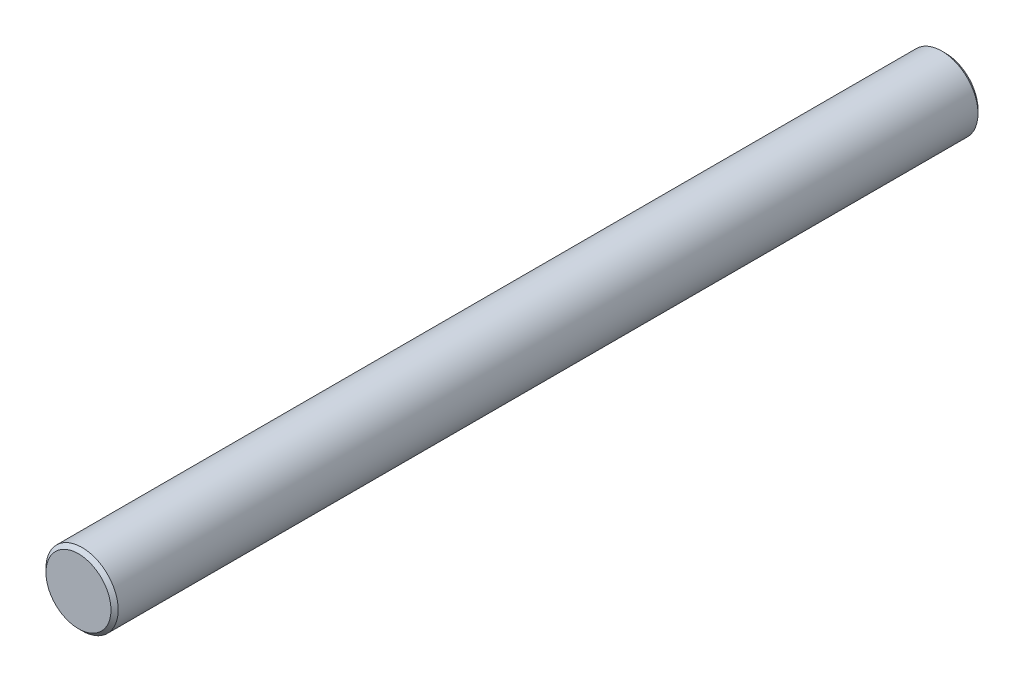
ISO-10303-21;
HEADER;
FILE_DESCRIPTION(('STEP AP214'),'2;1');
FILE_NAME('part.step','',(''),(''),'','','');
FILE_SCHEMA(('AUTOMOTIVE_DESIGN { 1 0 10303 214 1 1 1 1 }'));
ENDSEC;
DATA;
#1=APPLICATION_CONTEXT('core data for automotive mechanical design processes');
#2=APPLICATION_PROTOCOL_DEFINITION('international standard','automotive_design',2000,#1);
#3=PRODUCT_CONTEXT('',#1,'mechanical');
#4=PRODUCT('Part','Part','',(#3));
#5=PRODUCT_RELATED_PRODUCT_CATEGORY('part','',(#4));
#6=PRODUCT_DEFINITION_FORMATION('','',#4);
#7=PRODUCT_DEFINITION_CONTEXT('part definition',#1,'design');
#8=PRODUCT_DEFINITION('design','',#6,#7);
#9=PRODUCT_DEFINITION_SHAPE('','',#8);
#10=(LENGTH_UNIT() NAMED_UNIT(*) SI_UNIT(.MILLI.,.METRE.));
#11=(NAMED_UNIT(*) PLANE_ANGLE_UNIT() SI_UNIT($,.RADIAN.));
#12=(NAMED_UNIT(*) SI_UNIT($,.STERADIAN.) SOLID_ANGLE_UNIT());
#13=UNCERTAINTY_MEASURE_WITH_UNIT(LENGTH_MEASURE(1.E-05),#10,'distance_accuracy_value','');
#14=(GEOMETRIC_REPRESENTATION_CONTEXT(3) GLOBAL_UNCERTAINTY_ASSIGNED_CONTEXT((#13)) GLOBAL_UNIT_ASSIGNED_CONTEXT((#10,
#11,#12)) REPRESENTATION_CONTEXT('',''));
#15=CARTESIAN_POINT('',(0.,0.,0.));
#16=DIRECTION('',(0.,0.,1.));
#17=DIRECTION('',(1.,0.,0.));
#18=AXIS2_PLACEMENT_3D('',#15,#16,#17);
#19=CARTESIAN_POINT('',(0.,0.,60.));
#20=DIRECTION('',(0.,0.,-1.));
#21=DIRECTION('',(-1.,0.,0.));
#22=AXIS2_PLACEMENT_3D('',#19,#20,#21);
#23=CYLINDRICAL_SURFACE('',#22,5.);
#24=CARTESIAN_POINT('',(0.,0.,-59.5));
#25=DIRECTION('',(0.,0.,1.));
#26=DIRECTION('',(1.,0.,0.));
#27=AXIS2_PLACEMENT_3D('',#24,#25,#26);
#28=CIRCLE('',#27,5.);
#29=CARTESIAN_POINT('',(5.,0.,-59.5));
#30=VERTEX_POINT('',#29);
#31=EDGE_CURVE('E51',#30,#30,#28,.T.);
#32=ORIENTED_EDGE('',*,*,#31,.T.);
#33=EDGE_LOOP('',(#32));
#34=FACE_BOUND('',#33,.T.);
#35=CARTESIAN_POINT('',(0.,0.,59.5));
#36=DIRECTION('',(0.,0.,1.));
#37=DIRECTION('',(1.,0.,0.));
#38=AXIS2_PLACEMENT_3D('',#35,#36,#37);
#39=CIRCLE('',#38,5.);
#40=CARTESIAN_POINT('',(5.,0.,59.5));
#41=VERTEX_POINT('',#40);
#42=EDGE_CURVE('E55',#41,#41,#39,.F.);
#43=ORIENTED_EDGE('',*,*,#42,.T.);
#44=EDGE_LOOP('',(#43));
#45=FACE_BOUND('',#44,.T.);
#46=ADVANCED_FACE('F39',(#34,#45),#23,.T.);
#47=CARTESIAN_POINT('',(0.,0.,60.));
#48=DIRECTION('',(0.,0.,1.));
#49=DIRECTION('',(1.,0.,0.));
#50=AXIS2_PLACEMENT_3D('',#47,#48,#49);
#51=PLANE('',#50);
#52=CARTESIAN_POINT('',(0.,0.,60.));
#53=DIRECTION('',(0.,0.,1.));
#54=DIRECTION('',(1.,0.,0.));
#55=AXIS2_PLACEMENT_3D('',#52,#53,#54);
#56=CIRCLE('',#55,4.49999999999999);
#57=CARTESIAN_POINT('',(4.49999999999999,0.,60.));
#58=VERTEX_POINT('',#57);
#59=EDGE_CURVE('E10',#58,#58,#56,.T.);
#60=ORIENTED_EDGE('',*,*,#59,.T.);
#61=EDGE_LOOP('',(#60));
#62=FACE_BOUND('',#61,.T.);
#63=ADVANCED_FACE('F71',(#62),#51,.T.);
#64=CARTESIAN_POINT('',(0.,0.,-60.));
#65=DIRECTION('',(0.,0.,1.));
#66=DIRECTION('',(1.,0.,0.));
#67=AXIS2_PLACEMENT_3D('',#64,#65,#66);
#68=PLANE('',#67);
#69=CARTESIAN_POINT('',(0.,0.,-60.));
#70=DIRECTION('',(0.,0.,1.));
#71=DIRECTION('',(1.,0.,0.));
#72=AXIS2_PLACEMENT_3D('',#69,#70,#71);
#73=CIRCLE('',#72,4.50000000000003);
#74=CARTESIAN_POINT('',(4.50000000000003,0.,-60.));
#75=VERTEX_POINT('',#74);
#76=EDGE_CURVE('E47',#75,#75,#73,.F.);
#77=ORIENTED_EDGE('',*,*,#76,.T.);
#78=EDGE_LOOP('',(#77));
#79=FACE_BOUND('',#78,.T.);
#80=ADVANCED_FACE('F68',(#79),#68,.F.);
#81=CARTESIAN_POINT('',(0.,0.,-59.5));
#82=DIRECTION('',(0.,0.,1.));
#83=DIRECTION('',(1.,0.,0.));
#84=AXIS2_PLACEMENT_3D('',#81,#82,#83);
#85=CONICAL_SURFACE('',#84,5.,0.785398163397443);
#86=ORIENTED_EDGE('',*,*,#76,.F.);
#87=EDGE_LOOP('',(#86));
#88=FACE_BOUND('',#87,.T.);
#89=ORIENTED_EDGE('',*,*,#31,.F.);
#90=EDGE_LOOP('',(#89));
#91=FACE_BOUND('',#90,.T.);
#92=ADVANCED_FACE('F64',(#88,#91),#85,.T.);
#93=CARTESIAN_POINT('',(0.,0.,60.));
#94=DIRECTION('',(0.,0.,-1.));
#95=DIRECTION('',(-1.,0.,0.));
#96=AXIS2_PLACEMENT_3D('',#93,#94,#95);
#97=CONICAL_SURFACE('',#96,4.49999999999999,0.785398163397443);
#98=ORIENTED_EDGE('',*,*,#42,.F.);
#99=EDGE_LOOP('',(#98));
#100=FACE_BOUND('',#99,.T.);
#101=ORIENTED_EDGE('',*,*,#59,.F.);
#102=EDGE_LOOP('',(#101));
#103=FACE_BOUND('',#102,.T.);
#104=ADVANCED_FACE('F42',(#100,#103),#97,.T.);
#105=CLOSED_SHELL('',(#46,#63,#80,#92,#104));
#106=MANIFOLD_SOLID_BREP('B2',#105);
#107=ADVANCED_BREP_SHAPE_REPRESENTATION('',(#18,#106),#14);
#108=SHAPE_DEFINITION_REPRESENTATION(#9,#107);
ENDSEC;
END-ISO-10303-21;
